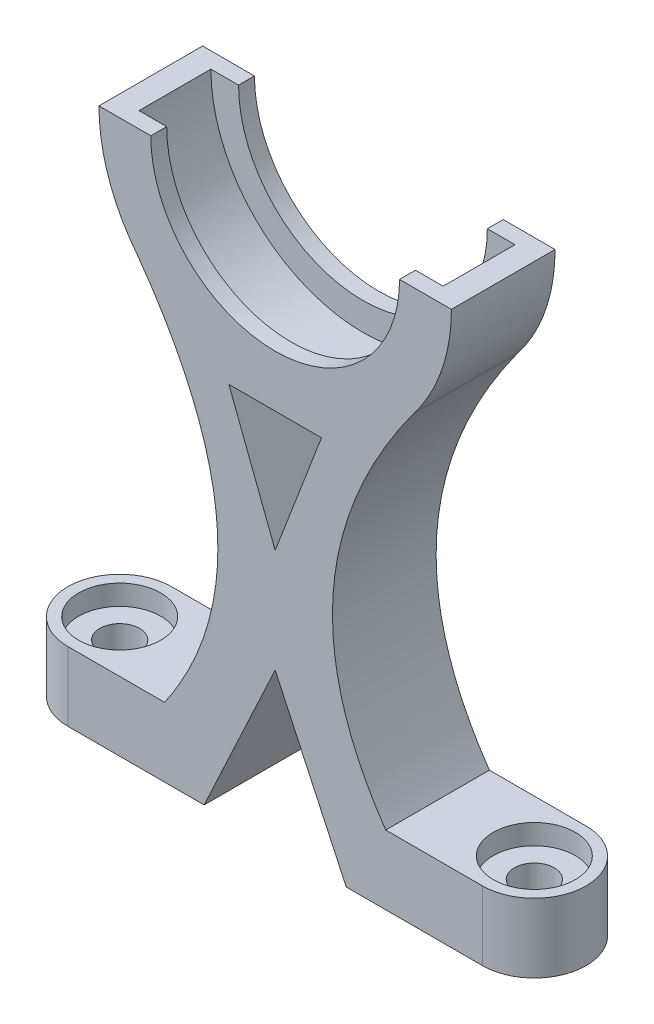
ISO-10303-21;
HEADER;
FILE_DESCRIPTION(('STEP AP214'),'2;1');
FILE_NAME('part.step','',(''),(''),'','','');
FILE_SCHEMA(('AUTOMOTIVE_DESIGN { 1 0 10303 214 1 1 1 1 }'));
ENDSEC;
DATA;
#1=APPLICATION_CONTEXT('core data for automotive mechanical design processes');
#2=APPLICATION_PROTOCOL_DEFINITION('international standard','automotive_design',2000,#1);
#3=PRODUCT_CONTEXT('',#1,'mechanical');
#4=PRODUCT('Part','Part','',(#3));
#5=PRODUCT_RELATED_PRODUCT_CATEGORY('part','',(#4));
#6=PRODUCT_DEFINITION_FORMATION('','',#4);
#7=PRODUCT_DEFINITION_CONTEXT('part definition',#1,'design');
#8=PRODUCT_DEFINITION('design','',#6,#7);
#9=PRODUCT_DEFINITION_SHAPE('','',#8);
#10=(LENGTH_UNIT() NAMED_UNIT(*) SI_UNIT(.MILLI.,.METRE.));
#11=(NAMED_UNIT(*) PLANE_ANGLE_UNIT() SI_UNIT($,.RADIAN.));
#12=(NAMED_UNIT(*) SI_UNIT($,.STERADIAN.) SOLID_ANGLE_UNIT());
#13=UNCERTAINTY_MEASURE_WITH_UNIT(LENGTH_MEASURE(1.E-05),#10,'distance_accuracy_value','');
#14=(GEOMETRIC_REPRESENTATION_CONTEXT(3) GLOBAL_UNCERTAINTY_ASSIGNED_CONTEXT((#13)) GLOBAL_UNIT_ASSIGNED_CONTEXT((#10,
#11,#12)) REPRESENTATION_CONTEXT('',''));
#15=CARTESIAN_POINT('',(0.,0.,0.));
#16=DIRECTION('',(0.,0.,1.));
#17=DIRECTION('',(1.,0.,0.));
#18=AXIS2_PLACEMENT_3D('',#15,#16,#17);
#19=CARTESIAN_POINT('',(0.,0.,4.7625));
#20=DIRECTION('',(0.,0.,-1.));
#21=DIRECTION('',(-1.,0.,0.));
#22=AXIS2_PLACEMENT_3D('',#19,#20,#21);
#23=CYLINDRICAL_SURFACE('',#22,11.43);
#24=DIRECTION('',(0.,0.,-1.));
#25=VECTOR('',#24,1.);
#26=CARTESIAN_POINT('',(-11.43,0.,4.7625));
#27=LINE('',#26,#25);
#28=CARTESIAN_POINT('',(-11.43,0.,-3.302));
#29=VERTEX_POINT('',#28);
#30=CARTESIAN_POINT('',(-11.43,0.,-4.7625));
#31=VERTEX_POINT('',#30);
#32=EDGE_CURVE('E242',#29,#31,#27,.T.);
#33=ORIENTED_EDGE('',*,*,#32,.F.);
#34=CARTESIAN_POINT('',(0.,0.,-3.302));
#35=DIRECTION('',(0.,0.,1.));
#36=DIRECTION('',(1.,0.,0.));
#37=AXIS2_PLACEMENT_3D('',#34,#35,#36);
#38=CIRCLE('',#37,11.43);
#39=CARTESIAN_POINT('',(11.43,0.,-3.302));
#40=VERTEX_POINT('',#39);
#41=EDGE_CURVE('E418',#29,#40,#38,.T.);
#42=ORIENTED_EDGE('',*,*,#41,.T.);
#43=DIRECTION('',(0.,0.,-1.));
#44=VECTOR('',#43,1.);
#45=CARTESIAN_POINT('',(11.43,0.,4.7625));
#46=LINE('',#45,#44);
#47=CARTESIAN_POINT('',(11.43,0.,-4.7625));
#48=VERTEX_POINT('',#47);
#49=EDGE_CURVE('E247',#40,#48,#46,.T.);
#50=ORIENTED_EDGE('',*,*,#49,.T.);
#51=CARTESIAN_POINT('',(0.,0.,-4.7625));
#52=DIRECTION('',(0.,0.,-1.));
#53=DIRECTION('',(1.,0.,0.));
#54=AXIS2_PLACEMENT_3D('',#51,#52,#53);
#55=CIRCLE('',#54,11.43);
#56=EDGE_CURVE('E233',#48,#31,#55,.T.);
#57=ORIENTED_EDGE('',*,*,#56,.T.);
#58=EDGE_LOOP('',(#33,#42,#50,#57));
#59=FACE_BOUND('',#58,.T.);
#60=ADVANCED_FACE('F39',(#59),#23,.F.);
#61=CARTESIAN_POINT('',(0.,0.,4.7625));
#62=DIRECTION('',(0.,0.,1.));
#63=DIRECTION('',(1.,0.,0.));
#64=AXIS2_PLACEMENT_3D('',#61,#62,#63);
#65=PLANE('',#64);
#66=CARTESIAN_POINT('',(0.,0.,4.7625));
#67=DIRECTION('',(0.,0.,1.));
#68=DIRECTION('',(1.,0.,0.));
#69=AXIS2_PLACEMENT_3D('',#66,#67,#68);
#70=CIRCLE('',#69,16.1925);
#71=CARTESIAN_POINT('',(-16.1925,0.,4.7625));
#72=VERTEX_POINT('',#71);
#73=CARTESIAN_POINT('',(-12.7,-10.0452504324183,4.7625));
#74=VERTEX_POINT('',#73);
#75=EDGE_CURVE('E238',#72,#74,#70,.T.);
#76=ORIENTED_EDGE('',*,*,#75,.T.);
#77=CARTESIAN_POINT('',(-12.7,-10.0452504324183,4.7625));
#78=CARTESIAN_POINT('',(0.767706838936873,-28.6514798163525,4.7625));
#79=CARTESIAN_POINT('',(-10.16,-44.45,4.7625));
#80=B_SPLINE_CURVE_WITH_KNOTS('',2,(#77,#78,#79),.UNSPECIFIED.,.F.,.F.,(3,3),(0.,1.),.UNSPECIFIED.);
#81=CARTESIAN_POINT('',(-10.16,-44.45,4.7625));
#82=VERTEX_POINT('',#81);
#83=EDGE_CURVE('E324',#74,#82,#80,.T.);
#84=ORIENTED_EDGE('',*,*,#83,.T.);
#85=DIRECTION('',(-1.,0.,0.));
#86=VECTOR('',#85,1.);
#87=CARTESIAN_POINT('',(-19.05,-44.45,4.7625));
#88=LINE('',#87,#86);
#89=CARTESIAN_POINT('',(-19.05,-44.45,4.7625));
#90=VERTEX_POINT('',#89);
#91=EDGE_CURVE('E329',#82,#90,#88,.T.);
#92=ORIENTED_EDGE('',*,*,#91,.T.);
#93=DIRECTION('',(0.,-1.,0.));
#94=VECTOR('',#93,1.);
#95=CARTESIAN_POINT('',(-19.05,-44.45,4.7625));
#96=LINE('',#95,#94);
#97=CARTESIAN_POINT('',(-19.05,-50.8,4.7625));
#98=VERTEX_POINT('',#97);
#99=EDGE_CURVE('E473',#90,#98,#96,.T.);
#100=ORIENTED_EDGE('',*,*,#99,.T.);
#101=DIRECTION('',(1.,0.,0.));
#102=VECTOR('',#101,1.);
#103=CARTESIAN_POINT('',(-19.05,-50.8,4.7625));
#104=LINE('',#103,#102);
#105=CARTESIAN_POINT('',(-6.52733267997109,-50.8,4.7625));
#106=VERTEX_POINT('',#105);
#107=EDGE_CURVE('E414',#98,#106,#104,.T.);
#108=ORIENTED_EDGE('',*,*,#107,.T.);
#109=DIRECTION('',(0.422618261740693,0.906307787036653,0.));
#110=VECTOR('',#109,1.);
#111=CARTESIAN_POINT('',(-6.52733267997109,-50.8,4.7625));
#112=LINE('',#111,#110);
#113=CARTESIAN_POINT('',(0.,-36.8020898953335,4.7625));
#114=VERTEX_POINT('',#113);
#115=EDGE_CURVE('E411',#106,#114,#112,.T.);
#116=ORIENTED_EDGE('',*,*,#115,.T.);
#117=DIRECTION('',(0.422618261740694,-0.906307787036653,0.));
#118=VECTOR('',#117,1.);
#119=CARTESIAN_POINT('',(6.5273326799711,-50.8,4.7625));
#120=LINE('',#119,#118);
#121=CARTESIAN_POINT('',(6.5273326799711,-50.8,4.7625));
#122=VERTEX_POINT('',#121);
#123=EDGE_CURVE('E468',#114,#122,#120,.T.);
#124=ORIENTED_EDGE('',*,*,#123,.T.);
#125=DIRECTION('',(1.,0.,0.));
#126=VECTOR('',#125,1.);
#127=CARTESIAN_POINT('',(19.05,-50.8,4.7625));
#128=LINE('',#127,#126);
#129=CARTESIAN_POINT('',(19.05,-50.8,4.7625));
#130=VERTEX_POINT('',#129);
#131=EDGE_CURVE('E467',#122,#130,#128,.T.);
#132=ORIENTED_EDGE('',*,*,#131,.T.);
#133=DIRECTION('',(0.,1.,0.));
#134=VECTOR('',#133,1.);
#135=CARTESIAN_POINT('',(19.05,-44.45,4.7625));
#136=LINE('',#135,#134);
#137=CARTESIAN_POINT('',(19.05,-44.45,4.7625));
#138=VERTEX_POINT('',#137);
#139=EDGE_CURVE('E195',#130,#138,#136,.T.);
#140=ORIENTED_EDGE('',*,*,#139,.T.);
#141=DIRECTION('',(-1.,0.,0.));
#142=VECTOR('',#141,1.);
#143=CARTESIAN_POINT('',(19.05,-44.45,4.7625));
#144=LINE('',#143,#142);
#145=CARTESIAN_POINT('',(10.16,-44.45,4.7625));
#146=VERTEX_POINT('',#145);
#147=EDGE_CURVE('E375',#138,#146,#144,.T.);
#148=ORIENTED_EDGE('',*,*,#147,.T.);
#149=CARTESIAN_POINT('',(10.16,-44.45,4.7625));
#150=CARTESIAN_POINT('',(-0.767706838936863,-28.6514798163525,4.7625));
#151=CARTESIAN_POINT('',(12.7,-10.0452504324183,4.7625));
#152=B_SPLINE_CURVE_WITH_KNOTS('',2,(#149,#150,#151),.UNSPECIFIED.,.F.,.F.,(3,3),(0.,1.),.UNSPECIFIED.);
#153=CARTESIAN_POINT('',(12.7,-10.0452504324183,4.7625));
#154=VERTEX_POINT('',#153);
#155=EDGE_CURVE('E368',#146,#154,#152,.T.);
#156=ORIENTED_EDGE('',*,*,#155,.T.);
#157=CARTESIAN_POINT('',(0.,0.,4.7625));
#158=DIRECTION('',(0.,0.,1.));
#159=DIRECTION('',(-1.,0.,0.));
#160=AXIS2_PLACEMENT_3D('',#157,#158,#159);
#161=CIRCLE('',#160,16.1925);
#162=CARTESIAN_POINT('',(16.1925,0.,4.7625));
#163=VERTEX_POINT('',#162);
#164=EDGE_CURVE('E374',#154,#163,#161,.T.);
#165=ORIENTED_EDGE('',*,*,#164,.T.);
#166=DIRECTION('',(-1.,0.,0.));
#167=VECTOR('',#166,1.);
#168=CARTESIAN_POINT('',(11.43,0.,4.7625));
#169=LINE('',#168,#167);
#170=CARTESIAN_POINT('',(11.43,0.,4.7625));
#171=VERTEX_POINT('',#170);
#172=EDGE_CURVE('E381',#163,#171,#169,.T.);
#173=ORIENTED_EDGE('',*,*,#172,.T.);
#174=CARTESIAN_POINT('',(0.,0.,4.7625));
#175=DIRECTION('',(0.,0.,-1.));
#176=DIRECTION('',(1.,0.,0.));
#177=AXIS2_PLACEMENT_3D('',#174,#175,#176);
#178=CIRCLE('',#177,11.43);
#179=CARTESIAN_POINT('',(-11.43,0.,4.7625));
#180=VERTEX_POINT('',#179);
#181=EDGE_CURVE('E383',#171,#180,#178,.T.);
#182=ORIENTED_EDGE('',*,*,#181,.T.);
#183=DIRECTION('',(-1.,0.,0.));
#184=VECTOR('',#183,1.);
#185=CARTESIAN_POINT('',(-16.1925,0.,4.7625));
#186=LINE('',#185,#184);
#187=EDGE_CURVE('E243',#180,#72,#186,.T.);
#188=ORIENTED_EDGE('',*,*,#187,.T.);
#189=EDGE_LOOP('',(#76,#84,#92,#100,#108,#116,#124,#132,#140,#148,#156,#165,#173,#182,#188));
#190=FACE_BOUND('',#189,.T.);
#191=DIRECTION('',(-1.,0.,0.));
#192=VECTOR('',#191,1.);
#193=CARTESIAN_POINT('',(4.25497540393559,-16.1925,4.7625));
#194=LINE('',#193,#192);
#195=CARTESIAN_POINT('',(4.25497540393559,-16.1925,4.7625));
#196=VERTEX_POINT('',#195);
#197=CARTESIAN_POINT('',(-4.2549754039356,-16.1925,4.7625));
#198=VERTEX_POINT('',#197);
#199=EDGE_CURVE('E302',#196,#198,#194,.T.);
#200=ORIENTED_EDGE('',*,*,#199,.F.);
#201=DIRECTION('',(0.358367949545305,0.9335804264972,0.));
#202=VECTOR('',#201,1.);
#203=CARTESIAN_POINT('',(4.25497540393559,-16.1925,4.7625));
#204=LINE('',#203,#202);
#205=CARTESIAN_POINT('',(0.,-27.2770898953335,4.7625));
#206=VERTEX_POINT('',#205);
#207=EDGE_CURVE('E300',#206,#196,#204,.T.);
#208=ORIENTED_EDGE('',*,*,#207,.F.);
#209=DIRECTION('',(0.358367949545305,-0.9335804264972,0.));
#210=VECTOR('',#209,1.);
#211=CARTESIAN_POINT('',(-4.25497540393559,-16.1925,4.7625));
#212=LINE('',#211,#210);
#213=EDGE_CURVE('E305',#198,#206,#212,.T.);
#214=ORIENTED_EDGE('',*,*,#213,.F.);
#215=EDGE_LOOP('',(#200,#208,#214));
#216=FACE_BOUND('',#215,.T.);
#217=ADVANCED_FACE('F465',(#190,#216),#65,.T.);
#218=CARTESIAN_POINT('',(0.,0.,-4.7625));
#219=DIRECTION('',(0.,0.,1.));
#220=DIRECTION('',(1.,0.,0.));
#221=AXIS2_PLACEMENT_3D('',#218,#219,#220);
#222=PLANE('',#221);
#223=CARTESIAN_POINT('',(0.,0.,-4.7625));
#224=DIRECTION('',(0.,0.,1.));
#225=DIRECTION('',(1.,0.,0.));
#226=AXIS2_PLACEMENT_3D('',#223,#224,#225);
#227=CIRCLE('',#226,16.1925);
#228=CARTESIAN_POINT('',(-16.1925,0.,-4.7625));
#229=VERTEX_POINT('',#228);
#230=CARTESIAN_POINT('',(-12.7,-10.0452504324183,-4.7625));
#231=VERTEX_POINT('',#230);
#232=EDGE_CURVE('E321',#229,#231,#227,.T.);
#233=ORIENTED_EDGE('',*,*,#232,.F.);
#234=DIRECTION('',(-1.,0.,0.));
#235=VECTOR('',#234,1.);
#236=CARTESIAN_POINT('',(-16.1925,0.,-4.7625));
#237=LINE('',#236,#235);
#238=EDGE_CURVE('E236',#31,#229,#237,.T.);
#239=ORIENTED_EDGE('',*,*,#238,.F.);
#240=ORIENTED_EDGE('',*,*,#56,.F.);
#241=DIRECTION('',(-1.,0.,0.));
#242=VECTOR('',#241,1.);
#243=CARTESIAN_POINT('',(11.43,0.,-4.7625));
#244=LINE('',#243,#242);
#245=CARTESIAN_POINT('',(16.1925,0.,-4.7625));
#246=VERTEX_POINT('',#245);
#247=EDGE_CURVE('E230',#246,#48,#244,.T.);
#248=ORIENTED_EDGE('',*,*,#247,.F.);
#249=CARTESIAN_POINT('',(0.,0.,-4.7625));
#250=DIRECTION('',(0.,0.,1.));
#251=DIRECTION('',(-1.,0.,0.));
#252=AXIS2_PLACEMENT_3D('',#249,#250,#251);
#253=CIRCLE('',#252,16.1925);
#254=CARTESIAN_POINT('',(12.7,-10.0452504324183,-4.7625));
#255=VERTEX_POINT('',#254);
#256=EDGE_CURVE('E225',#255,#246,#253,.T.);
#257=ORIENTED_EDGE('',*,*,#256,.F.);
#258=CARTESIAN_POINT('',(10.16,-44.45,-4.7625));
#259=CARTESIAN_POINT('',(-0.767706838936863,-28.6514798163525,-4.7625));
#260=CARTESIAN_POINT('',(12.7,-10.0452504324183,-4.7625));
#261=B_SPLINE_CURVE_WITH_KNOTS('',2,(#258,#259,#260),.UNSPECIFIED.,.F.,.F.,(3,3),(0.,1.),.UNSPECIFIED.);
#262=CARTESIAN_POINT('',(10.16,-44.45,-4.7625));
#263=VERTEX_POINT('',#262);
#264=EDGE_CURVE('E218',#263,#255,#261,.T.);
#265=ORIENTED_EDGE('',*,*,#264,.F.);
#266=DIRECTION('',(-1.,0.,0.));
#267=VECTOR('',#266,1.);
#268=CARTESIAN_POINT('',(19.05,-44.45,-4.7625));
#269=LINE('',#268,#267);
#270=CARTESIAN_POINT('',(19.05,-44.45,-4.7625));
#271=VERTEX_POINT('',#270);
#272=EDGE_CURVE('E216',#271,#263,#269,.T.);
#273=ORIENTED_EDGE('',*,*,#272,.F.);
#274=DIRECTION('',(0.,1.,0.));
#275=VECTOR('',#274,1.);
#276=CARTESIAN_POINT('',(19.05,-44.45,-4.7625));
#277=LINE('',#276,#275);
#278=CARTESIAN_POINT('',(19.05,-50.8,-4.7625));
#279=VERTEX_POINT('',#278);
#280=EDGE_CURVE('E192',#279,#271,#277,.T.);
#281=ORIENTED_EDGE('',*,*,#280,.F.);
#282=DIRECTION('',(1.,0.,0.));
#283=VECTOR('',#282,1.);
#284=CARTESIAN_POINT('',(19.05,-50.8,-4.7625));
#285=LINE('',#284,#283);
#286=CARTESIAN_POINT('',(6.5273326799711,-50.8,-4.7625));
#287=VERTEX_POINT('',#286);
#288=EDGE_CURVE('E204',#287,#279,#285,.T.);
#289=ORIENTED_EDGE('',*,*,#288,.F.);
#290=DIRECTION('',(0.422618261740694,-0.906307787036653,0.));
#291=VECTOR('',#290,1.);
#292=CARTESIAN_POINT('',(6.5273326799711,-50.8,-4.7625));
#293=LINE('',#292,#291);
#294=CARTESIAN_POINT('',(0.,-36.8020898953335,-4.7625));
#295=VERTEX_POINT('',#294);
#296=EDGE_CURVE('E210',#295,#287,#293,.T.);
#297=ORIENTED_EDGE('',*,*,#296,.F.);
#298=DIRECTION('',(0.422618261740693,0.906307787036653,0.));
#299=VECTOR('',#298,1.);
#300=CARTESIAN_POINT('',(-6.52733267997109,-50.8,-4.7625));
#301=LINE('',#300,#299);
#302=CARTESIAN_POINT('',(-6.52733267997109,-50.8,-4.7625));
#303=VERTEX_POINT('',#302);
#304=EDGE_CURVE('E403',#303,#295,#301,.T.);
#305=ORIENTED_EDGE('',*,*,#304,.F.);
#306=DIRECTION('',(1.,0.,0.));
#307=VECTOR('',#306,1.);
#308=CARTESIAN_POINT('',(-19.05,-50.8,-4.7625));
#309=LINE('',#308,#307);
#310=CARTESIAN_POINT('',(-19.05,-50.8,-4.7625));
#311=VERTEX_POINT('',#310);
#312=EDGE_CURVE('E401',#311,#303,#309,.T.);
#313=ORIENTED_EDGE('',*,*,#312,.F.);
#314=DIRECTION('',(0.,-1.,0.));
#315=VECTOR('',#314,1.);
#316=CARTESIAN_POINT('',(-19.05,-44.45,-4.7625));
#317=LINE('',#316,#315);
#318=CARTESIAN_POINT('',(-19.05,-44.45,-4.7625));
#319=VERTEX_POINT('',#318);
#320=EDGE_CURVE('E398',#319,#311,#317,.T.);
#321=ORIENTED_EDGE('',*,*,#320,.F.);
#322=DIRECTION('',(-1.,0.,0.));
#323=VECTOR('',#322,1.);
#324=CARTESIAN_POINT('',(-19.05,-44.45,-4.7625));
#325=LINE('',#324,#323);
#326=CARTESIAN_POINT('',(-10.16,-44.45,-4.7625));
#327=VERTEX_POINT('',#326);
#328=EDGE_CURVE('E392',#327,#319,#325,.T.);
#329=ORIENTED_EDGE('',*,*,#328,.F.);
#330=CARTESIAN_POINT('',(-12.7,-10.0452504324183,-4.7625));
#331=CARTESIAN_POINT('',(0.767706838936873,-28.6514798163525,-4.7625));
#332=CARTESIAN_POINT('',(-10.16,-44.45,-4.7625));
#333=B_SPLINE_CURVE_WITH_KNOTS('',2,(#330,#331,#332),.UNSPECIFIED.,.F.,.F.,(3,3),(0.,1.),.UNSPECIFIED.);
#334=EDGE_CURVE('E388',#231,#327,#333,.T.);
#335=ORIENTED_EDGE('',*,*,#334,.F.);
#336=EDGE_LOOP('',(#233,#239,#240,#248,#257,#265,#273,#281,#289,#297,#305,#313,#321,#329,#335));
#337=FACE_BOUND('',#336,.T.);
#338=DIRECTION('',(0.358367949545305,0.9335804264972,0.));
#339=VECTOR('',#338,1.);
#340=CARTESIAN_POINT('',(4.25497540393559,-16.1925,-4.7625));
#341=LINE('',#340,#339);
#342=CARTESIAN_POINT('',(0.,-27.2770898953335,-4.7625));
#343=VERTEX_POINT('',#342);
#344=CARTESIAN_POINT('',(4.25497540393559,-16.1925,-4.7625));
#345=VERTEX_POINT('',#344);
#346=EDGE_CURVE('E299',#343,#345,#341,.T.);
#347=ORIENTED_EDGE('',*,*,#346,.T.);
#348=DIRECTION('',(-1.,0.,0.));
#349=VECTOR('',#348,1.);
#350=CARTESIAN_POINT('',(4.25497540393559,-16.1925,-4.7625));
#351=LINE('',#350,#349);
#352=CARTESIAN_POINT('',(-4.25497540393559,-16.1925,-4.7625));
#353=VERTEX_POINT('',#352);
#354=EDGE_CURVE('E310',#345,#353,#351,.T.);
#355=ORIENTED_EDGE('',*,*,#354,.T.);
#356=DIRECTION('',(0.358367949545305,-0.9335804264972,0.));
#357=VECTOR('',#356,1.);
#358=CARTESIAN_POINT('',(-4.25497540393559,-16.1925,-4.7625));
#359=LINE('',#358,#357);
#360=EDGE_CURVE('E303',#353,#343,#359,.T.);
#361=ORIENTED_EDGE('',*,*,#360,.T.);
#362=EDGE_LOOP('',(#347,#355,#361));
#363=FACE_BOUND('',#362,.T.);
#364=ADVANCED_FACE('F213',(#337,#363),#222,.F.);
#365=CARTESIAN_POINT('',(0.,0.,4.7625));
#366=DIRECTION('',(0.,0.,-1.));
#367=DIRECTION('',(-1.,0.,0.));
#368=AXIS2_PLACEMENT_3D('',#365,#366,#367);
#369=CYLINDRICAL_SURFACE('',#368,16.1925);
#370=ORIENTED_EDGE('',*,*,#232,.T.);
#371=DIRECTION('',(0.,0.,-1.));
#372=VECTOR('',#371,1.);
#373=CARTESIAN_POINT('',(-12.7,-10.0452504324183,4.7625));
#374=LINE('',#373,#372);
#375=EDGE_CURVE('E270',#74,#231,#374,.T.);
#376=ORIENTED_EDGE('',*,*,#375,.F.);
#377=ORIENTED_EDGE('',*,*,#75,.F.);
#378=DIRECTION('',(0.,0.,-1.));
#379=VECTOR('',#378,1.);
#380=CARTESIAN_POINT('',(-16.1925,0.,4.7625));
#381=LINE('',#380,#379);
#382=EDGE_CURVE('E239',#72,#229,#381,.T.);
#383=ORIENTED_EDGE('',*,*,#382,.T.);
#384=EDGE_LOOP('',(#370,#376,#377,#383));
#385=FACE_BOUND('',#384,.T.);
#386=ADVANCED_FACE('F41',(#385),#369,.T.);
#387=DIRECTION('',(0.,0.,-1.));
#388=VECTOR('',#387,1.);
#389=SURFACE_OF_LINEAR_EXTRUSION('',#80,#388);
#390=ORIENTED_EDGE('',*,*,#334,.T.);
#391=DIRECTION('',(0.,0.,-1.));
#392=VECTOR('',#391,1.);
#393=CARTESIAN_POINT('',(-10.16,-44.45,4.7625));
#394=LINE('',#393,#392);
#395=EDGE_CURVE('E267',#82,#327,#394,.T.);
#396=ORIENTED_EDGE('',*,*,#395,.F.);
#397=ORIENTED_EDGE('',*,*,#83,.F.);
#398=ORIENTED_EDGE('',*,*,#375,.T.);
#399=EDGE_LOOP('',(#390,#396,#397,#398));
#400=FACE_BOUND('',#399,.T.);
#401=ADVANCED_FACE('F334',(#400),#389,.F.);
#402=CARTESIAN_POINT('',(-19.05,-44.45,4.7625));
#403=DIRECTION('',(0.,-1.,0.));
#404=DIRECTION('',(1.,0.,0.));
#405=AXIS2_PLACEMENT_3D('',#402,#403,#404);
#406=PLANE('',#405);
#407=CARTESIAN_POINT('',(-19.05,-44.45,0.));
#408=DIRECTION('',(0.,1.,0.));
#409=DIRECTION('',(0.,0.,1.));
#410=AXIS2_PLACEMENT_3D('',#407,#408,#409);
#411=CIRCLE('',#410,3.77063);
#412=CARTESIAN_POINT('',(-19.05,-44.45,3.77063));
#413=VERTEX_POINT('',#412);
#414=EDGE_CURVE('E791',#413,#413,#411,.T.);
#415=ORIENTED_EDGE('',*,*,#414,.F.);
#416=EDGE_LOOP('',(#415));
#417=FACE_BOUND('',#416,.T.);
#418=ORIENTED_EDGE('',*,*,#328,.T.);
#419=CARTESIAN_POINT('',(-19.05,-44.45,0.));
#420=DIRECTION('',(0.,1.,0.));
#421=DIRECTION('',(-1.,0.,0.));
#422=AXIS2_PLACEMENT_3D('',#419,#420,#421);
#423=CIRCLE('',#422,4.7625);
#424=EDGE_CURVE('E199',#319,#90,#423,.T.);
#425=ORIENTED_EDGE('',*,*,#424,.T.);
#426=ORIENTED_EDGE('',*,*,#91,.F.);
#427=ORIENTED_EDGE('',*,*,#395,.T.);
#428=EDGE_LOOP('',(#418,#425,#426,#427));
#429=FACE_BOUND('',#428,.T.);
#430=ADVANCED_FACE('F337',(#417,#429),#406,.F.);
#431=CARTESIAN_POINT('',(-19.05,-50.8,4.7625));
#432=DIRECTION('',(0.,1.,0.));
#433=DIRECTION('',(0.,0.,1.));
#434=AXIS2_PLACEMENT_3D('',#431,#432,#433);
#435=PLANE('',#434);
#436=CARTESIAN_POINT('',(-19.05,-50.8,0.));
#437=DIRECTION('',(0.,1.,0.));
#438=DIRECTION('',(0.,0.,1.));
#439=AXIS2_PLACEMENT_3D('',#436,#437,#438);
#440=CIRCLE('',#439,1.8288);
#441=CARTESIAN_POINT('',(-19.05,-50.8,1.8288));
#442=VERTEX_POINT('',#441);
#443=EDGE_CURVE('E798',#442,#442,#440,.T.);
#444=ORIENTED_EDGE('',*,*,#443,.T.);
#445=EDGE_LOOP('',(#444));
#446=FACE_BOUND('',#445,.T.);
#447=ORIENTED_EDGE('',*,*,#312,.T.);
#448=DIRECTION('',(0.,0.,-1.));
#449=VECTOR('',#448,1.);
#450=CARTESIAN_POINT('',(-6.52733267997109,-50.8,4.7625));
#451=LINE('',#450,#449);
#452=EDGE_CURVE('E264',#106,#303,#451,.T.);
#453=ORIENTED_EDGE('',*,*,#452,.F.);
#454=ORIENTED_EDGE('',*,*,#107,.F.);
#455=CARTESIAN_POINT('',(-19.05,-50.8,0.));
#456=DIRECTION('',(0.,1.,0.));
#457=DIRECTION('',(-1.,0.,0.));
#458=AXIS2_PLACEMENT_3D('',#455,#456,#457);
#459=CIRCLE('',#458,4.7625);
#460=EDGE_CURVE('E415',#311,#98,#459,.T.);
#461=ORIENTED_EDGE('',*,*,#460,.F.);
#462=EDGE_LOOP('',(#447,#453,#454,#461));
#463=FACE_BOUND('',#462,.T.);
#464=ADVANCED_FACE('F341',(#446,#463),#435,.F.);
#465=CARTESIAN_POINT('',(-6.52733267997109,-50.8,4.7625));
#466=DIRECTION('',(-0.906307787036653,0.422618261740693,0.));
#467=DIRECTION('',(-0.422618261740693,-0.906307787036653,0.));
#468=AXIS2_PLACEMENT_3D('',#465,#466,#467);
#469=PLANE('',#468);
#470=ORIENTED_EDGE('',*,*,#304,.T.);
#471=DIRECTION('',(0.,0.,-1.));
#472=VECTOR('',#471,1.);
#473=CARTESIAN_POINT('',(0.,-36.8020898953335,4.7625));
#474=LINE('',#473,#472);
#475=EDGE_CURVE('E261',#114,#295,#474,.T.);
#476=ORIENTED_EDGE('',*,*,#475,.F.);
#477=ORIENTED_EDGE('',*,*,#115,.F.);
#478=ORIENTED_EDGE('',*,*,#452,.T.);
#479=EDGE_LOOP('',(#470,#476,#477,#478));
#480=FACE_BOUND('',#479,.T.);
#481=ADVANCED_FACE('F345',(#480),#469,.F.);
#482=CARTESIAN_POINT('',(6.5273326799711,-50.8,4.7625));
#483=DIRECTION('',(0.906307787036652,0.422618261740694,0.));
#484=DIRECTION('',(-0.422618261740694,0.906307787036653,0.));
#485=AXIS2_PLACEMENT_3D('',#482,#483,#484);
#486=PLANE('',#485);
#487=ORIENTED_EDGE('',*,*,#296,.T.);
#488=DIRECTION('',(0.,0.,-1.));
#489=VECTOR('',#488,1.);
#490=CARTESIAN_POINT('',(6.5273326799711,-50.8,4.7625));
#491=LINE('',#490,#489);
#492=EDGE_CURVE('E207',#122,#287,#491,.T.);
#493=ORIENTED_EDGE('',*,*,#492,.F.);
#494=ORIENTED_EDGE('',*,*,#123,.F.);
#495=ORIENTED_EDGE('',*,*,#475,.T.);
#496=EDGE_LOOP('',(#487,#493,#494,#495));
#497=FACE_BOUND('',#496,.T.);
#498=ADVANCED_FACE('F349',(#497),#486,.F.);
#499=CARTESIAN_POINT('',(19.05,-50.8,4.7625));
#500=DIRECTION('',(0.,1.,0.));
#501=DIRECTION('',(-1.,0.,0.));
#502=AXIS2_PLACEMENT_3D('',#499,#500,#501);
#503=PLANE('',#502);
#504=CARTESIAN_POINT('',(19.05,-50.8,0.));
#505=DIRECTION('',(0.,1.,0.));
#506=DIRECTION('',(0.,0.,1.));
#507=AXIS2_PLACEMENT_3D('',#504,#505,#506);
#508=CIRCLE('',#507,1.8288);
#509=CARTESIAN_POINT('',(19.05,-50.8,1.8288));
#510=VERTEX_POINT('',#509);
#511=EDGE_CURVE('E450',#510,#510,#508,.T.);
#512=ORIENTED_EDGE('',*,*,#511,.T.);
#513=EDGE_LOOP('',(#512));
#514=FACE_BOUND('',#513,.T.);
#515=ORIENTED_EDGE('',*,*,#288,.T.);
#516=CARTESIAN_POINT('',(19.05,-50.8,0.));
#517=DIRECTION('',(0.,1.,0.));
#518=DIRECTION('',(-1.,0.,0.));
#519=AXIS2_PLACEMENT_3D('',#516,#517,#518);
#520=CIRCLE('',#519,4.7625);
#521=EDGE_CURVE('E188',#130,#279,#520,.T.);
#522=ORIENTED_EDGE('',*,*,#521,.F.);
#523=ORIENTED_EDGE('',*,*,#131,.F.);
#524=ORIENTED_EDGE('',*,*,#492,.T.);
#525=EDGE_LOOP('',(#515,#522,#523,#524));
#526=FACE_BOUND('',#525,.T.);
#527=ADVANCED_FACE('F205',(#514,#526),#503,.F.);
#528=CARTESIAN_POINT('',(19.05,-44.45,4.7625));
#529=DIRECTION('',(0.,-1.,0.));
#530=DIRECTION('',(1.,0.,0.));
#531=AXIS2_PLACEMENT_3D('',#528,#529,#530);
#532=PLANE('',#531);
#533=CARTESIAN_POINT('',(19.05,-44.45,0.));
#534=DIRECTION('',(0.,1.,0.));
#535=DIRECTION('',(0.,0.,1.));
#536=AXIS2_PLACEMENT_3D('',#533,#534,#535);
#537=CIRCLE('',#536,3.77063);
#538=CARTESIAN_POINT('',(19.05,-44.45,3.77063));
#539=VERTEX_POINT('',#538);
#540=EDGE_CURVE('E801',#539,#539,#537,.T.);
#541=ORIENTED_EDGE('',*,*,#540,.F.);
#542=EDGE_LOOP('',(#541));
#543=FACE_BOUND('',#542,.T.);
#544=ORIENTED_EDGE('',*,*,#272,.T.);
#545=DIRECTION('',(0.,0.,-1.));
#546=VECTOR('',#545,1.);
#547=CARTESIAN_POINT('',(10.16,-44.45,4.7625));
#548=LINE('',#547,#546);
#549=EDGE_CURVE('E257',#146,#263,#548,.T.);
#550=ORIENTED_EDGE('',*,*,#549,.F.);
#551=ORIENTED_EDGE('',*,*,#147,.F.);
#552=CARTESIAN_POINT('',(19.05,-44.45,0.));
#553=DIRECTION('',(0.,1.,0.));
#554=DIRECTION('',(-1.,0.,0.));
#555=AXIS2_PLACEMENT_3D('',#552,#553,#554);
#556=CIRCLE('',#555,4.7625);
#557=EDGE_CURVE('E200',#138,#271,#556,.T.);
#558=ORIENTED_EDGE('',*,*,#557,.T.);
#559=EDGE_LOOP('',(#544,#550,#551,#558));
#560=FACE_BOUND('',#559,.T.);
#561=ADVANCED_FACE('F356',(#543,#560),#532,.F.);
#562=DIRECTION('',(0.,0.,-1.));
#563=VECTOR('',#562,1.);
#564=SURFACE_OF_LINEAR_EXTRUSION('',#152,#563);
#565=ORIENTED_EDGE('',*,*,#264,.T.);
#566=DIRECTION('',(0.,0.,-1.));
#567=VECTOR('',#566,1.);
#568=CARTESIAN_POINT('',(12.7,-10.0452504324183,4.7625));
#569=LINE('',#568,#567);
#570=EDGE_CURVE('E254',#154,#255,#569,.T.);
#571=ORIENTED_EDGE('',*,*,#570,.F.);
#572=ORIENTED_EDGE('',*,*,#155,.F.);
#573=ORIENTED_EDGE('',*,*,#549,.T.);
#574=EDGE_LOOP('',(#565,#571,#572,#573));
#575=FACE_BOUND('',#574,.T.);
#576=ADVANCED_FACE('F360',(#575),#564,.F.);
#577=CARTESIAN_POINT('',(0.,0.,4.7625));
#578=DIRECTION('',(0.,0.,-1.));
#579=DIRECTION('',(-1.,0.,0.));
#580=AXIS2_PLACEMENT_3D('',#577,#578,#579);
#581=CYLINDRICAL_SURFACE('',#580,16.1925);
#582=ORIENTED_EDGE('',*,*,#256,.T.);
#583=DIRECTION('',(0.,0.,-1.));
#584=VECTOR('',#583,1.);
#585=CARTESIAN_POINT('',(16.1925,0.,4.7625));
#586=LINE('',#585,#584);
#587=EDGE_CURVE('E251',#163,#246,#586,.T.);
#588=ORIENTED_EDGE('',*,*,#587,.F.);
#589=ORIENTED_EDGE('',*,*,#164,.F.);
#590=ORIENTED_EDGE('',*,*,#570,.T.);
#591=EDGE_LOOP('',(#582,#588,#589,#590));
#592=FACE_BOUND('',#591,.T.);
#593=ADVANCED_FACE('F365',(#592),#581,.T.);
#594=CARTESIAN_POINT('',(11.43,0.,4.7625));
#595=DIRECTION('',(0.,-1.,0.));
#596=DIRECTION('',(0.,0.,-1.));
#597=AXIS2_PLACEMENT_3D('',#594,#595,#596);
#598=PLANE('',#597);
#599=ORIENTED_EDGE('',*,*,#49,.F.);
#600=DIRECTION('',(1.,0.,0.));
#601=VECTOR('',#600,1.);
#602=CARTESIAN_POINT('',(11.43,0.,-3.302));
#603=LINE('',#602,#601);
#604=CARTESIAN_POINT('',(13.97,0.,-3.302));
#605=VERTEX_POINT('',#604);
#606=EDGE_CURVE('E297',#40,#605,#603,.T.);
#607=ORIENTED_EDGE('',*,*,#606,.T.);
#608=DIRECTION('',(0.,0.,1.));
#609=VECTOR('',#608,1.);
#610=CARTESIAN_POINT('',(13.97,0.,0.));
#611=LINE('',#610,#609);
#612=CARTESIAN_POINT('',(13.97,0.,3.302));
#613=VERTEX_POINT('',#612);
#614=EDGE_CURVE('E285',#605,#613,#611,.T.);
#615=ORIENTED_EDGE('',*,*,#614,.T.);
#616=DIRECTION('',(-1.,0.,0.));
#617=VECTOR('',#616,1.);
#618=CARTESIAN_POINT('',(11.43,0.,3.302));
#619=LINE('',#618,#617);
#620=CARTESIAN_POINT('',(11.43,0.,3.302));
#621=VERTEX_POINT('',#620);
#622=EDGE_CURVE('E288',#613,#621,#619,.T.);
#623=ORIENTED_EDGE('',*,*,#622,.T.);
#624=EDGE_CURVE('E248',#171,#621,#46,.T.);
#625=ORIENTED_EDGE('',*,*,#624,.F.);
#626=ORIENTED_EDGE('',*,*,#172,.F.);
#627=ORIENTED_EDGE('',*,*,#587,.T.);
#628=ORIENTED_EDGE('',*,*,#247,.T.);
#629=EDGE_LOOP('',(#599,#607,#615,#623,#625,#626,#627,#628));
#630=FACE_BOUND('',#629,.T.);
#631=ADVANCED_FACE('F439',(#630),#598,.F.);
#632=ORIENTED_EDGE('',*,*,#624,.T.);
#633=CARTESIAN_POINT('',(0.,0.,3.302));
#634=DIRECTION('',(0.,0.,1.));
#635=DIRECTION('',(1.,0.,0.));
#636=AXIS2_PLACEMENT_3D('',#633,#634,#635);
#637=CIRCLE('',#636,11.43);
#638=CARTESIAN_POINT('',(-11.43,0.,3.302));
#639=VERTEX_POINT('',#638);
#640=EDGE_CURVE('E292',#639,#621,#637,.T.);
#641=ORIENTED_EDGE('',*,*,#640,.F.);
#642=EDGE_CURVE('E244',#180,#639,#27,.T.);
#643=ORIENTED_EDGE('',*,*,#642,.F.);
#644=ORIENTED_EDGE('',*,*,#181,.F.);
#645=EDGE_LOOP('',(#632,#641,#643,#644));
#646=FACE_BOUND('',#645,.T.);
#647=ADVANCED_FACE('F463',(#646),#23,.F.);
#648=CARTESIAN_POINT('',(-16.1925,0.,4.7625));
#649=DIRECTION('',(0.,-1.,0.));
#650=DIRECTION('',(0.,0.,-1.));
#651=AXIS2_PLACEMENT_3D('',#648,#649,#650);
#652=PLANE('',#651);
#653=DIRECTION('',(0.,0.,1.));
#654=VECTOR('',#653,1.);
#655=CARTESIAN_POINT('',(-13.97,0.,0.));
#656=LINE('',#655,#654);
#657=CARTESIAN_POINT('',(-13.97,0.,3.302));
#658=VERTEX_POINT('',#657);
#659=CARTESIAN_POINT('',(-13.97,0.,-3.302));
#660=VERTEX_POINT('',#659);
#661=EDGE_CURVE('E47',#658,#660,#656,.F.);
#662=ORIENTED_EDGE('',*,*,#661,.T.);
#663=DIRECTION('',(1.,0.,0.));
#664=VECTOR('',#663,1.);
#665=CARTESIAN_POINT('',(-16.1925,0.,-3.302));
#666=LINE('',#665,#664);
#667=EDGE_CURVE('E11',#660,#29,#666,.T.);
#668=ORIENTED_EDGE('',*,*,#667,.T.);
#669=ORIENTED_EDGE('',*,*,#32,.T.);
#670=ORIENTED_EDGE('',*,*,#238,.T.);
#671=ORIENTED_EDGE('',*,*,#382,.F.);
#672=ORIENTED_EDGE('',*,*,#187,.F.);
#673=ORIENTED_EDGE('',*,*,#642,.T.);
#674=DIRECTION('',(-1.,0.,0.));
#675=VECTOR('',#674,1.);
#676=CARTESIAN_POINT('',(-16.1925,0.,3.302));
#677=LINE('',#676,#675);
#678=EDGE_CURVE('E273',#639,#658,#677,.T.);
#679=ORIENTED_EDGE('',*,*,#678,.T.);
#680=EDGE_LOOP('',(#662,#668,#669,#670,#671,#672,#673,#679));
#681=FACE_BOUND('',#680,.T.);
#682=ADVANCED_FACE('F277',(#681),#652,.F.);
#683=CARTESIAN_POINT('',(4.25497540393559,-16.1925,4.7625));
#684=DIRECTION('',(-0.9335804264972,0.358367949545305,0.));
#685=DIRECTION('',(-0.358367949545305,-0.9335804264972,0.));
#686=AXIS2_PLACEMENT_3D('',#683,#684,#685);
#687=PLANE('',#686);
#688=ORIENTED_EDGE('',*,*,#346,.F.);
#689=DIRECTION('',(0.,0.,-1.));
#690=VECTOR('',#689,1.);
#691=CARTESIAN_POINT('',(0.,-27.2770898953335,4.7625));
#692=LINE('',#691,#690);
#693=EDGE_CURVE('E307',#206,#343,#692,.T.);
#694=ORIENTED_EDGE('',*,*,#693,.F.);
#695=ORIENTED_EDGE('',*,*,#207,.T.);
#696=DIRECTION('',(0.,0.,-1.));
#697=VECTOR('',#696,1.);
#698=CARTESIAN_POINT('',(4.25497540393559,-16.1925,4.7625));
#699=LINE('',#698,#697);
#700=EDGE_CURVE('E318',#196,#345,#699,.T.);
#701=ORIENTED_EDGE('',*,*,#700,.T.);
#702=EDGE_LOOP('',(#688,#694,#695,#701));
#703=FACE_BOUND('',#702,.T.);
#704=ADVANCED_FACE('F483',(#703),#687,.T.);
#705=CARTESIAN_POINT('',(4.25497540393559,-16.1925,4.7625));
#706=DIRECTION('',(0.,-1.,0.));
#707=DIRECTION('',(0.,0.,-1.));
#708=AXIS2_PLACEMENT_3D('',#705,#706,#707);
#709=PLANE('',#708);
#710=ORIENTED_EDGE('',*,*,#354,.F.);
#711=ORIENTED_EDGE('',*,*,#700,.F.);
#712=ORIENTED_EDGE('',*,*,#199,.T.);
#713=DIRECTION('',(0.,0.,-1.));
#714=VECTOR('',#713,1.);
#715=CARTESIAN_POINT('',(-4.25497540393559,-16.1925,4.7625));
#716=LINE('',#715,#714);
#717=EDGE_CURVE('E62',#198,#353,#716,.T.);
#718=ORIENTED_EDGE('',*,*,#717,.T.);
#719=EDGE_LOOP('',(#710,#711,#712,#718));
#720=FACE_BOUND('',#719,.T.);
#721=ADVANCED_FACE('F481',(#720),#709,.T.);
#722=CARTESIAN_POINT('',(-4.25497540393559,-16.1925,4.7625));
#723=DIRECTION('',(0.9335804264972,0.358367949545305,0.));
#724=DIRECTION('',(-0.358367949545305,0.9335804264972,0.));
#725=AXIS2_PLACEMENT_3D('',#722,#723,#724);
#726=PLANE('',#725);
#727=ORIENTED_EDGE('',*,*,#360,.F.);
#728=ORIENTED_EDGE('',*,*,#717,.F.);
#729=ORIENTED_EDGE('',*,*,#213,.T.);
#730=ORIENTED_EDGE('',*,*,#693,.T.);
#731=EDGE_LOOP('',(#727,#728,#729,#730));
#732=FACE_BOUND('',#731,.T.);
#733=ADVANCED_FACE('F485',(#732),#726,.T.);
#734=CARTESIAN_POINT('',(0.,-13.97,-3.302));
#735=DIRECTION('',(0.,0.,-1.));
#736=DIRECTION('',(-1.,0.,0.));
#737=AXIS2_PLACEMENT_3D('',#734,#735,#736);
#738=PLANE('',#737);
#739=ORIENTED_EDGE('',*,*,#41,.F.);
#740=ORIENTED_EDGE('',*,*,#667,.F.);
#741=CARTESIAN_POINT('',(0.,0.,-3.302));
#742=DIRECTION('',(0.,0.,1.));
#743=DIRECTION('',(1.,0.,0.));
#744=AXIS2_PLACEMENT_3D('',#741,#742,#743);
#745=CIRCLE('',#744,13.97);
#746=EDGE_CURVE('E284',#660,#605,#745,.T.);
#747=ORIENTED_EDGE('',*,*,#746,.T.);
#748=ORIENTED_EDGE('',*,*,#606,.F.);
#749=EDGE_LOOP('',(#739,#740,#747,#748));
#750=FACE_BOUND('',#749,.T.);
#751=ADVANCED_FACE('F487',(#750),#738,.F.);
#752=CARTESIAN_POINT('',(0.,0.,0.));
#753=DIRECTION('',(0.,0.,1.));
#754=DIRECTION('',(1.,0.,0.));
#755=AXIS2_PLACEMENT_3D('',#752,#753,#754);
#756=CYLINDRICAL_SURFACE('',#755,13.97);
#757=ORIENTED_EDGE('',*,*,#746,.F.);
#758=ORIENTED_EDGE('',*,*,#661,.F.);
#759=CARTESIAN_POINT('',(0.,0.,3.302));
#760=DIRECTION('',(0.,0.,1.));
#761=DIRECTION('',(1.,0.,0.));
#762=AXIS2_PLACEMENT_3D('',#759,#760,#761);
#763=CIRCLE('',#762,13.97);
#764=EDGE_CURVE('E54',#658,#613,#763,.T.);
#765=ORIENTED_EDGE('',*,*,#764,.T.);
#766=ORIENTED_EDGE('',*,*,#614,.F.);
#767=EDGE_LOOP('',(#757,#758,#765,#766));
#768=FACE_BOUND('',#767,.T.);
#769=ADVANCED_FACE('F281',(#768),#756,.F.);
#770=CARTESIAN_POINT('',(0.,-13.97,3.302));
#771=DIRECTION('',(0.,0.,1.));
#772=DIRECTION('',(1.,0.,0.));
#773=AXIS2_PLACEMENT_3D('',#770,#771,#772);
#774=PLANE('',#773);
#775=ORIENTED_EDGE('',*,*,#764,.F.);
#776=ORIENTED_EDGE('',*,*,#678,.F.);
#777=ORIENTED_EDGE('',*,*,#640,.T.);
#778=ORIENTED_EDGE('',*,*,#622,.F.);
#779=EDGE_LOOP('',(#775,#776,#777,#778));
#780=FACE_BOUND('',#779,.T.);
#781=ADVANCED_FACE('F458',(#780),#774,.F.);
#782=CARTESIAN_POINT('',(-19.05,-50.8,0.));
#783=DIRECTION('',(0.,1.,0.));
#784=DIRECTION('',(-1.,0.,0.));
#785=AXIS2_PLACEMENT_3D('',#782,#783,#784);
#786=CYLINDRICAL_SURFACE('',#785,4.7625);
#787=ORIENTED_EDGE('',*,*,#424,.F.);
#788=ORIENTED_EDGE('',*,*,#320,.T.);
#789=ORIENTED_EDGE('',*,*,#460,.T.);
#790=ORIENTED_EDGE('',*,*,#99,.F.);
#791=EDGE_LOOP('',(#787,#788,#789,#790));
#792=FACE_BOUND('',#791,.T.);
#793=ADVANCED_FACE('F420',(#792),#786,.T.);
#794=CARTESIAN_POINT('',(19.05,-50.8,0.));
#795=DIRECTION('',(0.,1.,0.));
#796=DIRECTION('',(-1.,0.,0.));
#797=AXIS2_PLACEMENT_3D('',#794,#795,#796);
#798=CYLINDRICAL_SURFACE('',#797,4.7625);
#799=ORIENTED_EDGE('',*,*,#557,.F.);
#800=ORIENTED_EDGE('',*,*,#139,.F.);
#801=ORIENTED_EDGE('',*,*,#521,.T.);
#802=ORIENTED_EDGE('',*,*,#280,.T.);
#803=EDGE_LOOP('',(#799,#800,#801,#802));
#804=FACE_BOUND('',#803,.T.);
#805=ADVANCED_FACE('F190',(#804),#798,.T.);
#806=CARTESIAN_POINT('',(19.05,-44.45,0.));
#807=DIRECTION('',(0.,1.,0.));
#808=DIRECTION('',(0.,0.,1.));
#809=AXIS2_PLACEMENT_3D('',#806,#807,#808);
#810=CYLINDRICAL_SURFACE('',#809,1.8288);
#811=ORIENTED_EDGE('',*,*,#511,.F.);
#812=EDGE_LOOP('',(#811));
#813=FACE_BOUND('',#812,.T.);
#814=CARTESIAN_POINT('',(19.05,-46.3042,0.));
#815=DIRECTION('',(0.,1.,0.));
#816=DIRECTION('',(0.,0.,1.));
#817=AXIS2_PLACEMENT_3D('',#814,#815,#816);
#818=CIRCLE('',#817,1.8288);
#819=CARTESIAN_POINT('',(19.05,-46.3042,1.8288));
#820=VERTEX_POINT('',#819);
#821=EDGE_CURVE('E453',#820,#820,#818,.T.);
#822=ORIENTED_EDGE('',*,*,#821,.T.);
#823=EDGE_LOOP('',(#822));
#824=FACE_BOUND('',#823,.T.);
#825=ADVANCED_FACE('F707',(#813,#824),#810,.F.);
#826=CARTESIAN_POINT('',(20.8788,-46.3042,0.));
#827=DIRECTION('',(0.,-1.,0.));
#828=DIRECTION('',(0.,0.,-1.));
#829=AXIS2_PLACEMENT_3D('',#826,#827,#828);
#830=PLANE('',#829);
#831=ORIENTED_EDGE('',*,*,#821,.F.);
#832=EDGE_LOOP('',(#831));
#833=FACE_BOUND('',#832,.T.);
#834=CARTESIAN_POINT('',(19.05,-46.3042,0.));
#835=DIRECTION('',(0.,1.,0.));
#836=DIRECTION('',(0.,0.,1.));
#837=AXIS2_PLACEMENT_3D('',#834,#835,#836);
#838=CIRCLE('',#837,3.77063);
#839=CARTESIAN_POINT('',(19.05,-46.3042,3.77063));
#840=VERTEX_POINT('',#839);
#841=EDGE_CURVE('E804',#840,#840,#838,.T.);
#842=ORIENTED_EDGE('',*,*,#841,.T.);
#843=EDGE_LOOP('',(#842));
#844=FACE_BOUND('',#843,.T.);
#845=ADVANCED_FACE('F714',(#833,#844),#830,.F.);
#846=CARTESIAN_POINT('',(19.05,-44.45,0.));
#847=DIRECTION('',(0.,1.,0.));
#848=DIRECTION('',(0.,0.,1.));
#849=AXIS2_PLACEMENT_3D('',#846,#847,#848);
#850=CYLINDRICAL_SURFACE('',#849,3.77063);
#851=ORIENTED_EDGE('',*,*,#841,.F.);
#852=EDGE_LOOP('',(#851));
#853=FACE_BOUND('',#852,.T.);
#854=ORIENTED_EDGE('',*,*,#540,.T.);
#855=EDGE_LOOP('',(#854));
#856=FACE_BOUND('',#855,.T.);
#857=ADVANCED_FACE('F723',(#853,#856),#850,.F.);
#858=CARTESIAN_POINT('',(-19.05,-44.45,0.));
#859=DIRECTION('',(0.,1.,0.));
#860=DIRECTION('',(0.,0.,1.));
#861=AXIS2_PLACEMENT_3D('',#858,#859,#860);
#862=CYLINDRICAL_SURFACE('',#861,1.8288);
#863=ORIENTED_EDGE('',*,*,#443,.F.);
#864=EDGE_LOOP('',(#863));
#865=FACE_BOUND('',#864,.T.);
#866=CARTESIAN_POINT('',(-19.05,-46.3042,0.));
#867=DIRECTION('',(0.,1.,0.));
#868=DIRECTION('',(0.,0.,1.));
#869=AXIS2_PLACEMENT_3D('',#866,#867,#868);
#870=CIRCLE('',#869,1.8288);
#871=CARTESIAN_POINT('',(-19.05,-46.3042,1.8288));
#872=VERTEX_POINT('',#871);
#873=EDGE_CURVE('E793',#872,#872,#870,.T.);
#874=ORIENTED_EDGE('',*,*,#873,.T.);
#875=EDGE_LOOP('',(#874));
#876=FACE_BOUND('',#875,.T.);
#877=ADVANCED_FACE('F733',(#865,#876),#862,.F.);
#878=CARTESIAN_POINT('',(-17.2212,-46.3042,0.));
#879=DIRECTION('',(0.,-1.,0.));
#880=DIRECTION('',(0.,0.,-1.));
#881=AXIS2_PLACEMENT_3D('',#878,#879,#880);
#882=PLANE('',#881);
#883=ORIENTED_EDGE('',*,*,#873,.F.);
#884=EDGE_LOOP('',(#883));
#885=FACE_BOUND('',#884,.T.);
#886=CARTESIAN_POINT('',(-19.05,-46.3042,0.));
#887=DIRECTION('',(0.,1.,0.));
#888=DIRECTION('',(0.,0.,1.));
#889=AXIS2_PLACEMENT_3D('',#886,#887,#888);
#890=CIRCLE('',#889,3.77063);
#891=CARTESIAN_POINT('',(-19.05,-46.3042,3.77063));
#892=VERTEX_POINT('',#891);
#893=EDGE_CURVE('E788',#892,#892,#890,.T.);
#894=ORIENTED_EDGE('',*,*,#893,.T.);
#895=EDGE_LOOP('',(#894));
#896=FACE_BOUND('',#895,.T.);
#897=ADVANCED_FACE('F743',(#885,#896),#882,.F.);
#898=CARTESIAN_POINT('',(-19.05,-44.45,0.));
#899=DIRECTION('',(0.,1.,0.));
#900=DIRECTION('',(0.,0.,1.));
#901=AXIS2_PLACEMENT_3D('',#898,#899,#900);
#902=CYLINDRICAL_SURFACE('',#901,3.77063);
#903=ORIENTED_EDGE('',*,*,#893,.F.);
#904=EDGE_LOOP('',(#903));
#905=FACE_BOUND('',#904,.T.);
#906=ORIENTED_EDGE('',*,*,#414,.T.);
#907=EDGE_LOOP('',(#906));
#908=FACE_BOUND('',#907,.T.);
#909=ADVANCED_FACE('F753',(#905,#908),#902,.F.);
#910=CLOSED_SHELL('',(#60,#217,#364,#386,#401,#430,#464,#481,#498,#527,#561,#576,#593,#631,#647,
#682,#704,#721,#733,#751,#769,#781,#793,#805,#825,#845,#857,#877,#897,#909));
#911=MANIFOLD_SOLID_BREP('B2',#910);
#912=ADVANCED_BREP_SHAPE_REPRESENTATION('',(#18,#911),#14);
#913=SHAPE_DEFINITION_REPRESENTATION(#9,#912);
ENDSEC;
END-ISO-10303-21;
